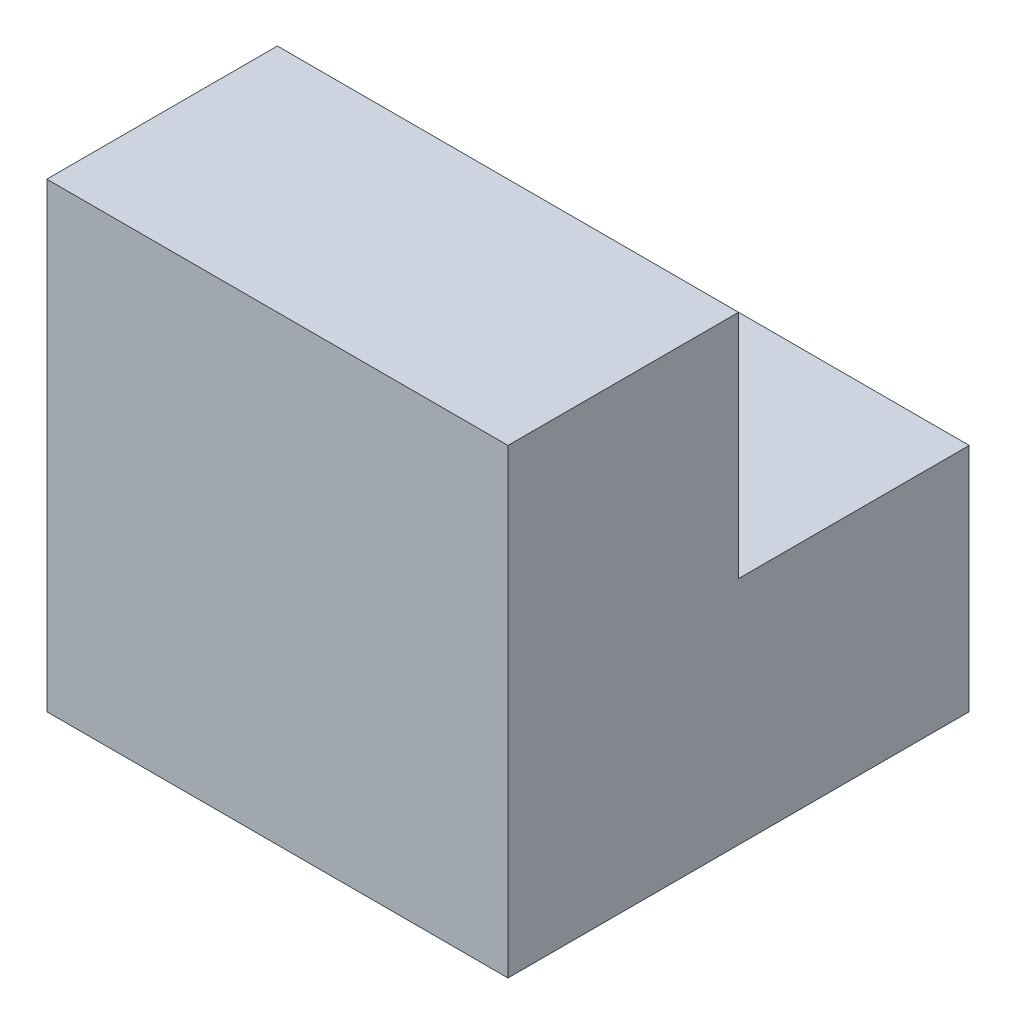
ISO-10303-21;
HEADER;
FILE_DESCRIPTION(('STEP AP214'),'2;1');
FILE_NAME('part.step','',(''),(''),'','','');
FILE_SCHEMA(('AUTOMOTIVE_DESIGN { 1 0 10303 214 1 1 1 1 }'));
ENDSEC;
DATA;
#1=APPLICATION_CONTEXT('core data for automotive mechanical design processes');
#2=APPLICATION_PROTOCOL_DEFINITION('international standard','automotive_design',2000,#1);
#3=PRODUCT_CONTEXT('',#1,'mechanical');
#4=PRODUCT('Part','Part','',(#3));
#5=PRODUCT_RELATED_PRODUCT_CATEGORY('part','',(#4));
#6=PRODUCT_DEFINITION_FORMATION('','',#4);
#7=PRODUCT_DEFINITION_CONTEXT('part definition',#1,'design');
#8=PRODUCT_DEFINITION('design','',#6,#7);
#9=PRODUCT_DEFINITION_SHAPE('','',#8);
#10=(LENGTH_UNIT() NAMED_UNIT(*) SI_UNIT(.MILLI.,.METRE.));
#11=(NAMED_UNIT(*) PLANE_ANGLE_UNIT() SI_UNIT($,.RADIAN.));
#12=(NAMED_UNIT(*) SI_UNIT($,.STERADIAN.) SOLID_ANGLE_UNIT());
#13=UNCERTAINTY_MEASURE_WITH_UNIT(LENGTH_MEASURE(1.E-05),#10,'distance_accuracy_value','');
#14=(GEOMETRIC_REPRESENTATION_CONTEXT(3) GLOBAL_UNCERTAINTY_ASSIGNED_CONTEXT((#13)) GLOBAL_UNIT_ASSIGNED_CONTEXT((#10,
#11,#12)) REPRESENTATION_CONTEXT('',''));
#15=CARTESIAN_POINT('',(0.,0.,0.));
#16=DIRECTION('',(0.,0.,1.));
#17=DIRECTION('',(1.,0.,0.));
#18=AXIS2_PLACEMENT_3D('',#15,#16,#17);
#19=CARTESIAN_POINT('',(0.,25.4,0.));
#20=DIRECTION('',(0.,1.,0.));
#21=DIRECTION('',(0.,0.,1.));
#22=AXIS2_PLACEMENT_3D('',#19,#20,#21);
#23=PLANE('',#22);
#24=DIRECTION('',(0.,0.,1.));
#25=VECTOR('',#24,1.);
#26=CARTESIAN_POINT('',(0.,25.4,0.));
#27=LINE('',#26,#25);
#28=CARTESIAN_POINT('',(0.,25.4,0.));
#29=VERTEX_POINT('',#28);
#30=CARTESIAN_POINT('',(0.,25.4,25.4));
#31=VERTEX_POINT('',#30);
#32=EDGE_CURVE('E83',#29,#31,#27,.T.);
#33=ORIENTED_EDGE('',*,*,#32,.T.);
#34=DIRECTION('',(-1.,0.,0.));
#35=VECTOR('',#34,1.);
#36=CARTESIAN_POINT('',(25.4,25.4,25.4));
#37=LINE('',#36,#35);
#38=CARTESIAN_POINT('',(50.8,25.4,25.4));
#39=VERTEX_POINT('',#38);
#40=EDGE_CURVE('E48',#39,#31,#37,.T.);
#41=ORIENTED_EDGE('',*,*,#40,.F.);
#42=DIRECTION('',(0.,0.,-1.));
#43=VECTOR('',#42,1.);
#44=CARTESIAN_POINT('',(50.8,25.4,0.));
#45=LINE('',#44,#43);
#46=CARTESIAN_POINT('',(50.8,25.4,0.));
#47=VERTEX_POINT('',#46);
#48=EDGE_CURVE('E134',#39,#47,#45,.T.);
#49=ORIENTED_EDGE('',*,*,#48,.T.);
#50=DIRECTION('',(-1.,0.,0.));
#51=VECTOR('',#50,1.);
#52=CARTESIAN_POINT('',(0.,25.4,0.));
#53=LINE('',#52,#51);
#54=EDGE_CURVE('E54',#47,#29,#53,.T.);
#55=ORIENTED_EDGE('',*,*,#54,.T.);
#56=EDGE_LOOP('',(#33,#41,#49,#55));
#57=FACE_BOUND('',#56,.T.);
#58=ADVANCED_FACE('F33',(#57),#23,.T.);
#59=CARTESIAN_POINT('',(0.,25.4,0.));
#60=DIRECTION('',(1.,0.,0.));
#61=DIRECTION('',(0.,0.,-1.));
#62=AXIS2_PLACEMENT_3D('',#59,#60,#61);
#63=PLANE('',#62);
#64=DIRECTION('',(0.,0.,1.));
#65=VECTOR('',#64,1.);
#66=CARTESIAN_POINT('',(0.,0.,0.));
#67=LINE('',#66,#65);
#68=CARTESIAN_POINT('',(0.,0.,0.));
#69=VERTEX_POINT('',#68);
#70=CARTESIAN_POINT('',(0.,0.,50.8));
#71=VERTEX_POINT('',#70);
#72=EDGE_CURVE('E89',#69,#71,#67,.T.);
#73=ORIENTED_EDGE('',*,*,#72,.T.);
#74=DIRECTION('',(0.,-1.,0.));
#75=VECTOR('',#74,1.);
#76=CARTESIAN_POINT('',(0.,25.4,50.8));
#77=LINE('',#76,#75);
#78=CARTESIAN_POINT('',(0.,50.8,50.8));
#79=VERTEX_POINT('',#78);
#80=EDGE_CURVE('E11',#79,#71,#77,.T.);
#81=ORIENTED_EDGE('',*,*,#80,.F.);
#82=DIRECTION('',(0.,0.,-1.));
#83=VECTOR('',#82,1.);
#84=CARTESIAN_POINT('',(0.,50.8,25.4));
#85=LINE('',#84,#83);
#86=CARTESIAN_POINT('',(0.,50.8,25.4));
#87=VERTEX_POINT('',#86);
#88=EDGE_CURVE('E126',#79,#87,#85,.T.);
#89=ORIENTED_EDGE('',*,*,#88,.T.);
#90=DIRECTION('',(0.,-1.,0.));
#91=VECTOR('',#90,1.);
#92=CARTESIAN_POINT('',(0.,50.8,25.4));
#93=LINE('',#92,#91);
#94=EDGE_CURVE('E140',#87,#31,#93,.T.);
#95=ORIENTED_EDGE('',*,*,#94,.T.);
#96=ORIENTED_EDGE('',*,*,#32,.F.);
#97=DIRECTION('',(0.,-1.,0.));
#98=VECTOR('',#97,1.);
#99=CARTESIAN_POINT('',(0.,25.4,0.));
#100=LINE('',#99,#98);
#101=EDGE_CURVE('E76',#29,#69,#100,.T.);
#102=ORIENTED_EDGE('',*,*,#101,.T.);
#103=EDGE_LOOP('',(#73,#81,#89,#95,#96,#102));
#104=FACE_BOUND('',#103,.T.);
#105=ADVANCED_FACE('F35',(#104),#63,.F.);
#106=CARTESIAN_POINT('',(0.,25.4,50.8));
#107=DIRECTION('',(0.,0.,-1.));
#108=DIRECTION('',(-1.,0.,0.));
#109=AXIS2_PLACEMENT_3D('',#106,#107,#108);
#110=PLANE('',#109);
#111=DIRECTION('',(1.,0.,0.));
#112=VECTOR('',#111,1.);
#113=CARTESIAN_POINT('',(0.,0.,50.8));
#114=LINE('',#113,#112);
#115=CARTESIAN_POINT('',(50.8,0.,50.8));
#116=VERTEX_POINT('',#115);
#117=EDGE_CURVE('E93',#71,#116,#114,.T.);
#118=ORIENTED_EDGE('',*,*,#117,.T.);
#119=DIRECTION('',(0.,-1.,0.));
#120=VECTOR('',#119,1.);
#121=CARTESIAN_POINT('',(50.8,25.4,50.8));
#122=LINE('',#121,#120);
#123=CARTESIAN_POINT('',(50.8,50.8,50.8));
#124=VERTEX_POINT('',#123);
#125=EDGE_CURVE('E41',#124,#116,#122,.T.);
#126=ORIENTED_EDGE('',*,*,#125,.F.);
#127=DIRECTION('',(1.,0.,0.));
#128=VECTOR('',#127,1.);
#129=CARTESIAN_POINT('',(25.4,50.8,50.8));
#130=LINE('',#129,#128);
#131=EDGE_CURVE('E118',#79,#124,#130,.T.);
#132=ORIENTED_EDGE('',*,*,#131,.F.);
#133=ORIENTED_EDGE('',*,*,#80,.T.);
#134=EDGE_LOOP('',(#118,#126,#132,#133));
#135=FACE_BOUND('',#134,.T.);
#136=ADVANCED_FACE('F116',(#135),#110,.F.);
#137=CARTESIAN_POINT('',(50.8,25.4,0.));
#138=DIRECTION('',(-1.,0.,0.));
#139=DIRECTION('',(0.,0.,1.));
#140=AXIS2_PLACEMENT_3D('',#137,#138,#139);
#141=PLANE('',#140);
#142=DIRECTION('',(0.,0.,-1.));
#143=VECTOR('',#142,1.);
#144=CARTESIAN_POINT('',(50.8,0.,0.));
#145=LINE('',#144,#143);
#146=CARTESIAN_POINT('',(50.8,0.,0.));
#147=VERTEX_POINT('',#146);
#148=EDGE_CURVE('E84',#116,#147,#145,.T.);
#149=ORIENTED_EDGE('',*,*,#148,.T.);
#150=DIRECTION('',(0.,-1.,0.));
#151=VECTOR('',#150,1.);
#152=CARTESIAN_POINT('',(50.8,25.4,0.));
#153=LINE('',#152,#151);
#154=EDGE_CURVE('E79',#47,#147,#153,.T.);
#155=ORIENTED_EDGE('',*,*,#154,.F.);
#156=ORIENTED_EDGE('',*,*,#48,.F.);
#157=DIRECTION('',(0.,-1.,0.));
#158=VECTOR('',#157,1.);
#159=CARTESIAN_POINT('',(50.8,50.8,25.4));
#160=LINE('',#159,#158);
#161=CARTESIAN_POINT('',(50.8,50.8,25.4));
#162=VERTEX_POINT('',#161);
#163=EDGE_CURVE('E94',#162,#39,#160,.T.);
#164=ORIENTED_EDGE('',*,*,#163,.F.);
#165=DIRECTION('',(0.,0.,-1.));
#166=VECTOR('',#165,1.);
#167=CARTESIAN_POINT('',(50.8,50.8,25.4));
#168=LINE('',#167,#166);
#169=EDGE_CURVE('E112',#124,#162,#168,.T.);
#170=ORIENTED_EDGE('',*,*,#169,.F.);
#171=ORIENTED_EDGE('',*,*,#125,.T.);
#172=EDGE_LOOP('',(#149,#155,#156,#164,#170,#171));
#173=FACE_BOUND('',#172,.T.);
#174=ADVANCED_FACE('F108',(#173),#141,.F.);
#175=CARTESIAN_POINT('',(0.,25.4,0.));
#176=DIRECTION('',(0.,0.,1.));
#177=DIRECTION('',(1.,0.,0.));
#178=AXIS2_PLACEMENT_3D('',#175,#176,#177);
#179=PLANE('',#178);
#180=DIRECTION('',(-1.,0.,0.));
#181=VECTOR('',#180,1.);
#182=CARTESIAN_POINT('',(0.,0.,0.));
#183=LINE('',#182,#181);
#184=EDGE_CURVE('E73',#147,#69,#183,.T.);
#185=ORIENTED_EDGE('',*,*,#184,.T.);
#186=ORIENTED_EDGE('',*,*,#101,.F.);
#187=ORIENTED_EDGE('',*,*,#54,.F.);
#188=ORIENTED_EDGE('',*,*,#154,.T.);
#189=EDGE_LOOP('',(#185,#186,#187,#188));
#190=FACE_BOUND('',#189,.T.);
#191=ADVANCED_FACE('F75',(#190),#179,.F.);
#192=CARTESIAN_POINT('',(0.,0.,0.));
#193=DIRECTION('',(0.,1.,0.));
#194=DIRECTION('',(0.,0.,1.));
#195=AXIS2_PLACEMENT_3D('',#192,#193,#194);
#196=PLANE('',#195);
#197=ORIENTED_EDGE('',*,*,#72,.F.);
#198=ORIENTED_EDGE('',*,*,#184,.F.);
#199=ORIENTED_EDGE('',*,*,#148,.F.);
#200=ORIENTED_EDGE('',*,*,#117,.F.);
#201=EDGE_LOOP('',(#197,#198,#199,#200));
#202=FACE_BOUND('',#201,.T.);
#203=ADVANCED_FACE('F92',(#202),#196,.F.);
#204=CARTESIAN_POINT('',(25.4,50.8,25.4));
#205=DIRECTION('',(0.,0.,1.));
#206=DIRECTION('',(1.,0.,0.));
#207=AXIS2_PLACEMENT_3D('',#204,#205,#206);
#208=PLANE('',#207);
#209=ORIENTED_EDGE('',*,*,#40,.T.);
#210=ORIENTED_EDGE('',*,*,#94,.F.);
#211=DIRECTION('',(-1.,0.,0.));
#212=VECTOR('',#211,1.);
#213=CARTESIAN_POINT('',(25.4,50.8,25.4));
#214=LINE('',#213,#212);
#215=EDGE_CURVE('E98',#162,#87,#214,.T.);
#216=ORIENTED_EDGE('',*,*,#215,.F.);
#217=ORIENTED_EDGE('',*,*,#163,.T.);
#218=EDGE_LOOP('',(#209,#210,#216,#217));
#219=FACE_BOUND('',#218,.T.);
#220=ADVANCED_FACE('F137',(#219),#208,.F.);
#221=CARTESIAN_POINT('',(0.,50.8,0.));
#222=DIRECTION('',(0.,1.,0.));
#223=DIRECTION('',(0.,0.,1.));
#224=AXIS2_PLACEMENT_3D('',#221,#222,#223);
#225=PLANE('',#224);
#226=ORIENTED_EDGE('',*,*,#215,.T.);
#227=ORIENTED_EDGE('',*,*,#88,.F.);
#228=ORIENTED_EDGE('',*,*,#131,.T.);
#229=ORIENTED_EDGE('',*,*,#169,.T.);
#230=EDGE_LOOP('',(#226,#227,#228,#229));
#231=FACE_BOUND('',#230,.T.);
#232=ADVANCED_FACE('F124',(#231),#225,.T.);
#233=CLOSED_SHELL('',(#58,#105,#136,#174,#191,#203,#220,#232));
#234=MANIFOLD_SOLID_BREP('B2',#233);
#235=ADVANCED_BREP_SHAPE_REPRESENTATION('',(#18,#234),#14);
#236=SHAPE_DEFINITION_REPRESENTATION(#9,#235);
ENDSEC;
END-ISO-10303-21;
